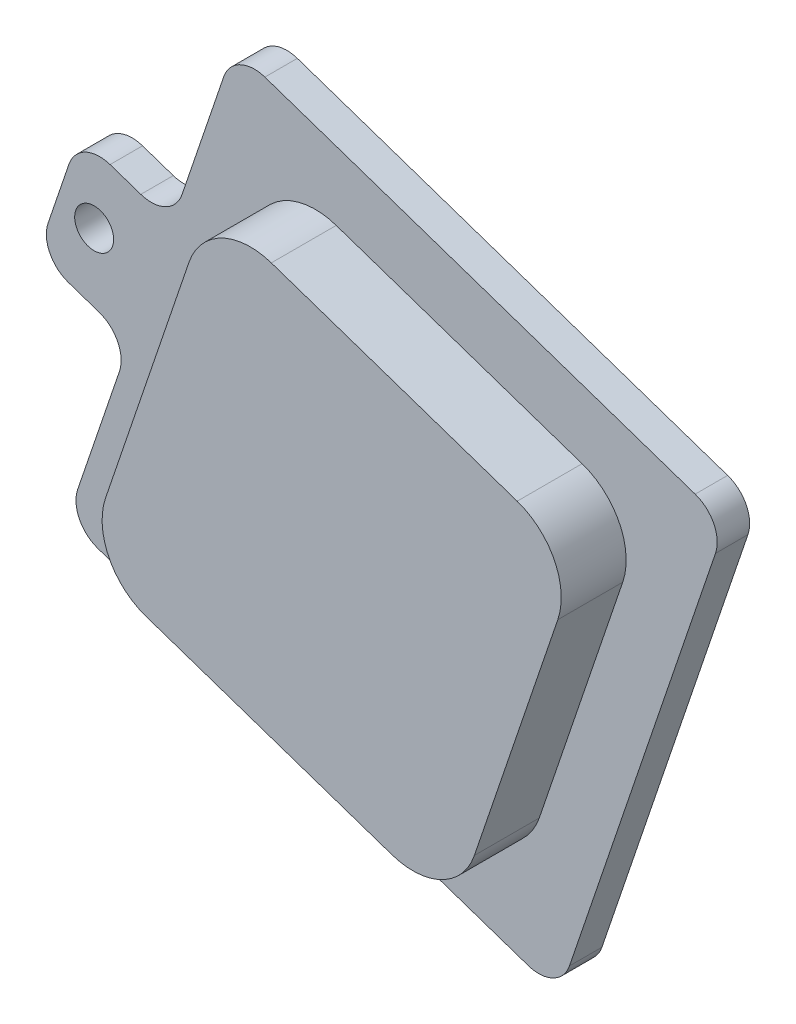
ISO-10303-21;
HEADER;
FILE_DESCRIPTION(('STEP AP214'),'2;1');
FILE_NAME('part.step','',(''),(''),'','','');
FILE_SCHEMA(('AUTOMOTIVE_DESIGN { 1 0 10303 214 1 1 1 1 }'));
ENDSEC;
DATA;
#1=APPLICATION_CONTEXT('core data for automotive mechanical design processes');
#2=APPLICATION_PROTOCOL_DEFINITION('international standard','automotive_design',2000,#1);
#3=PRODUCT_CONTEXT('',#1,'mechanical');
#4=PRODUCT('Part','Part','',(#3));
#5=PRODUCT_RELATED_PRODUCT_CATEGORY('part','',(#4));
#6=PRODUCT_DEFINITION_FORMATION('','',#4);
#7=PRODUCT_DEFINITION_CONTEXT('part definition',#1,'design');
#8=PRODUCT_DEFINITION('design','',#6,#7);
#9=PRODUCT_DEFINITION_SHAPE('','',#8);
#10=(LENGTH_UNIT() NAMED_UNIT(*) SI_UNIT(.MILLI.,.METRE.));
#11=(NAMED_UNIT(*) PLANE_ANGLE_UNIT() SI_UNIT($,.RADIAN.));
#12=(NAMED_UNIT(*) SI_UNIT($,.STERADIAN.) SOLID_ANGLE_UNIT());
#13=UNCERTAINTY_MEASURE_WITH_UNIT(LENGTH_MEASURE(1.E-05),#10,'distance_accuracy_value','');
#14=(GEOMETRIC_REPRESENTATION_CONTEXT(3) GLOBAL_UNCERTAINTY_ASSIGNED_CONTEXT((#13)) GLOBAL_UNIT_ASSIGNED_CONTEXT((#10,
#11,#12)) REPRESENTATION_CONTEXT('',''));
#15=CARTESIAN_POINT('',(0.,0.,0.));
#16=DIRECTION('',(0.,0.,1.));
#17=DIRECTION('',(1.,0.,0.));
#18=AXIS2_PLACEMENT_3D('',#15,#16,#17);
#19=CARTESIAN_POINT('',(0.,0.,3.175));
#20=DIRECTION('',(0.,0.,1.));
#21=DIRECTION('',(1.,0.,0.));
#22=AXIS2_PLACEMENT_3D('',#19,#20,#21);
#23=PLANE('',#22);
#24=CARTESIAN_POINT('',(-6.82627897238503,9.42656393700877,3.175));
#25=DIRECTION('',(0.,0.,1.));
#26=DIRECTION('',(1.,0.,0.));
#27=AXIS2_PLACEMENT_3D('',#24,#25,#26);
#28=CIRCLE('',#27,1.90499999999999);
#29=CARTESIAN_POINT('',(-4.92127897238505,9.42656393700877,3.175));
#30=VERTEX_POINT('',#29);
#31=EDGE_CURVE('E519',#30,#30,#28,.T.);
#32=ORIENTED_EDGE('',*,*,#31,.F.);
#33=EDGE_LOOP('',(#32));
#34=FACE_BOUND('',#33,.T.);
#35=DIRECTION('',(0.946970684541196,-0.321319969220056,0.));
#36=VECTOR('',#35,1.);
#37=CARTESIAN_POINT('',(-18.4754992217396,-13.4430700037001,3.175));
#38=LINE('',#37,#36);
#39=CARTESIAN_POINT('',(-6.44897152806643,-17.5238336127949,3.175));
#40=VERTEX_POINT('',#39);
#41=CARTESIAN_POINT('',(35.6438753997898,-31.8065062446263,3.175));
#42=VERTEX_POINT('',#41);
#43=EDGE_CURVE('E234',#40,#42,#38,.T.);
#44=ORIENTED_EDGE('',*,*,#43,.T.);
#45=CARTESIAN_POINT('',(36.6640663020634,-28.799874321208,3.175));
#46=DIRECTION('',(0.,0.,1.));
#47=DIRECTION('',(1.,0.,0.));
#48=AXIS2_PLACEMENT_3D('',#45,#46,#47);
#49=CIRCLE('',#48,3.175);
#50=CARTESIAN_POINT('',(39.6706982254818,-29.8200652234817,3.175));
#51=VERTEX_POINT('',#50);
#52=EDGE_CURVE('E274',#42,#51,#49,.T.);
#53=ORIENTED_EDGE('',*,*,#52,.T.);
#54=DIRECTION('',(0.321319969220055,0.946970684541197,0.));
#55=VECTOR('',#54,1.);
#56=CARTESIAN_POINT('',(38.6505073232081,-32.8266971469,3.175));
#57=LINE('',#56,#55);
#58=CARTESIAN_POINT('',(53.9533708573132,12.2727817043745,3.175));
#59=VERTEX_POINT('',#58);
#60=EDGE_CURVE('E243',#51,#59,#57,.T.);
#61=ORIENTED_EDGE('',*,*,#60,.T.);
#62=CARTESIAN_POINT('',(50.9467389338949,13.2929726066482,3.175));
#63=DIRECTION('',(0.,0.,1.));
#64=DIRECTION('',(1.,0.,0.));
#65=AXIS2_PLACEMENT_3D('',#62,#63,#64);
#66=CIRCLE('',#65,3.175);
#67=CARTESIAN_POINT('',(51.9669298361686,16.2996045300665,3.175));
#68=VERTEX_POINT('',#67);
#69=EDGE_CURVE('E268',#59,#68,#66,.T.);
#70=ORIENTED_EDGE('',*,*,#69,.T.);
#71=DIRECTION('',(-0.946970684541197,0.321319969220055,0.));
#72=VECTOR('',#71,1.);
#73=CARTESIAN_POINT('',(54.9735617595869,15.2794136277928,3.175));
#74=LINE('',#73,#72);
#75=CARTESIAN_POINT('',(9.87408290831238,30.5822771618979,3.175));
#76=VERTEX_POINT('',#75);
#77=EDGE_CURVE('E246',#68,#76,#74,.T.);
#78=ORIENTED_EDGE('',*,*,#77,.T.);
#79=CARTESIAN_POINT('',(8.85389200603872,27.5756452384796,3.175));
#80=DIRECTION('',(0.,0.,1.));
#81=DIRECTION('',(1.,0.,0.));
#82=AXIS2_PLACEMENT_3D('',#79,#80,#81);
#83=CIRCLE('',#82,3.175);
#84=CARTESIAN_POINT('',(5.84726008262042,28.5958361407533,3.175));
#85=VERTEX_POINT('',#84);
#86=EDGE_CURVE('E270',#76,#85,#83,.T.);
#87=ORIENTED_EDGE('',*,*,#86,.T.);
#88=DIRECTION('',(-0.321319969220055,-0.946970684541197,0.));
#89=VECTOR('',#88,1.);
#90=CARTESIAN_POINT('',(6.86745098489409,31.6024680641716,3.175));
#91=LINE('',#90,#89);
#92=CARTESIAN_POINT('',(1.76649647352571,16.5693084470801,3.175));
#93=VERTEX_POINT('',#92);
#94=EDGE_CURVE('E221',#85,#93,#91,.T.);
#95=ORIENTED_EDGE('',*,*,#94,.T.);
#96=CARTESIAN_POINT('',(-1.24013544989258,17.5894993493538,3.175));
#97=DIRECTION('',(0.,0.,1.));
#98=DIRECTION('',(1.,0.,0.));
#99=AXIS2_PLACEMENT_3D('',#96,#97,#98);
#100=CIRCLE('',#99,3.175);
#101=CARTESIAN_POINT('',(-2.26032635216626,14.5828674259355,3.175));
#102=VERTEX_POINT('',#101);
#103=EDGE_CURVE('E203',#93,#102,#100,.F.);
#104=ORIENTED_EDGE('',*,*,#103,.T.);
#105=DIRECTION('',(-0.946970684541197,0.321319969220055,0.));
#106=VECTOR('',#105,1.);
#107=CARTESIAN_POINT('',(0.746305571252041,13.5626765236618,3.175));
#108=LINE('',#107,#106);
#109=CARTESIAN_POINT('',(-5.26695827558457,15.6030583282092,3.175));
#110=VERTEX_POINT('',#109);
#111=EDGE_CURVE('E213',#102,#110,#108,.T.);
#112=ORIENTED_EDGE('',*,*,#111,.T.);
#113=CARTESIAN_POINT('',(-6.28714917785825,12.5964264047909,3.175));
#114=DIRECTION('',(0.,0.,1.));
#115=DIRECTION('',(1.,0.,0.));
#116=AXIS2_PLACEMENT_3D('',#113,#114,#115);
#117=CIRCLE('',#116,3.175);
#118=CARTESIAN_POINT('',(-9.29378110127655,13.6166173070645,3.175));
#119=VERTEX_POINT('',#118);
#120=EDGE_CURVE('E264',#110,#119,#117,.T.);
#121=ORIENTED_EDGE('',*,*,#120,.T.);
#122=DIRECTION('',(-0.321319969220055,-0.946970684541197,0.));
#123=VECTOR('',#122,1.);
#124=CARTESIAN_POINT('',(-2.15244478536083,34.6630407709926,3.175));
#125=LINE('',#124,#123);
#126=CARTESIAN_POINT('',(-11.3341629058239,7.60335346022794,3.175));
#127=VERTEX_POINT('',#126);
#128=EDGE_CURVE('E249',#119,#127,#125,.T.);
#129=ORIENTED_EDGE('',*,*,#128,.T.);
#130=CARTESIAN_POINT('',(-8.3275309824056,6.58316255795425,3.175));
#131=DIRECTION('',(0.,0.,1.));
#132=DIRECTION('',(1.,0.,0.));
#133=AXIS2_PLACEMENT_3D('',#130,#131,#132);
#134=CIRCLE('',#133,3.175);
#135=CARTESIAN_POINT('',(-9.34772188467928,3.57653063453595,3.175));
#136=VERTEX_POINT('',#135);
#137=EDGE_CURVE('E266',#127,#136,#134,.T.);
#138=ORIENTED_EDGE('',*,*,#137,.T.);
#139=DIRECTION('',(0.946970684541197,-0.321319969220055,0.));
#140=VECTOR('',#139,1.);
#141=CARTESIAN_POINT('',(-12.3543538080976,4.59672153680963,3.175));
#142=LINE('',#141,#140);
#143=CARTESIAN_POINT('',(-6.34108996126098,2.55633973226228,3.175));
#144=VERTEX_POINT('',#143);
#145=EDGE_CURVE('E387',#136,#144,#142,.T.);
#146=ORIENTED_EDGE('',*,*,#145,.T.);
#147=CARTESIAN_POINT('',(-7.36128086353465,-0.450292191156025,3.175));
#148=DIRECTION('',(0.,0.,1.));
#149=DIRECTION('',(1.,0.,0.));
#150=AXIS2_PLACEMENT_3D('',#147,#148,#149);
#151=CIRCLE('',#150,3.175);
#152=CARTESIAN_POINT('',(-4.35464894011635,-1.4704830934297,3.175));
#153=VERTEX_POINT('',#152);
#154=EDGE_CURVE('E313',#144,#153,#151,.F.);
#155=ORIENTED_EDGE('',*,*,#154,.T.);
#156=DIRECTION('',(-0.321319969220056,-0.946970684541197,0.));
#157=VECTOR('',#156,1.);
#158=CARTESIAN_POINT('',(-3.33445803784267,1.5361488299886,3.175));
#159=LINE('',#158,#157);
#160=CARTESIAN_POINT('',(-8.43541254921105,-13.4970107871029,3.175));
#161=VERTEX_POINT('',#160);
#162=EDGE_CURVE('E226',#153,#161,#159,.T.);
#163=ORIENTED_EDGE('',*,*,#162,.T.);
#164=CARTESIAN_POINT('',(-5.42878062579275,-14.5172016893766,3.175));
#165=DIRECTION('',(0.,0.,1.));
#166=DIRECTION('',(1.,0.,0.));
#167=AXIS2_PLACEMENT_3D('',#164,#165,#166);
#168=CIRCLE('',#167,3.175);
#169=EDGE_CURVE('E272',#161,#40,#168,.T.);
#170=ORIENTED_EDGE('',*,*,#169,.T.);
#171=EDGE_LOOP('',(#44,#53,#61,#70,#78,#87,#95,#104,#112,#121,#129,#138,#146,#155,#163,#170));
#172=FACE_BOUND('',#171,.T.);
#173=DIRECTION('',(-0.321319969220055,-0.946970684541197,0.));
#174=VECTOR('',#173,1.);
#175=CARTESIAN_POINT('',(-1.40195780010076,-12.530760668232,3.175));
#176=LINE('',#175,#174);
#177=CARTESIAN_POINT('',(8.79995122263599,17.535558565951,3.175));
#178=VERTEX_POINT('',#177);
#179=CARTESIAN_POINT('',(0.63842400444659,-6.51749682139537,3.175));
#180=VERTEX_POINT('',#179);
#181=EDGE_CURVE('E355',#178,#180,#176,.T.);
#182=ORIENTED_EDGE('',*,*,#181,.F.);
#183=CARTESIAN_POINT('',(14.8132150694726,15.4951767614037,3.175));
#184=DIRECTION('',(0.,0.,1.));
#185=DIRECTION('',(1.,0.,0.));
#186=AXIS2_PLACEMENT_3D('',#183,#184,#185);
#187=CIRCLE('',#186,6.35);
#188=CARTESIAN_POINT('',(16.8535968740199,21.5084406082403,3.175));
#189=VERTEX_POINT('',#188);
#190=EDGE_CURVE('E342',#178,#189,#187,.F.);
#191=ORIENTED_EDGE('',*,*,#190,.T.);
#192=DIRECTION('',(-0.946970684541197,0.321319969220055,0.));
#193=VECTOR('',#192,1.);
#194=CARTESIAN_POINT('',(10.8403330271833,23.5488224127876,3.175));
#195=LINE('',#194,#193);
#196=CARTESIAN_POINT('',(40.9066522613663,13.3469133900509,3.175));
#197=VERTEX_POINT('',#196);
#198=EDGE_CURVE('E379',#197,#189,#195,.T.);
#199=ORIENTED_EDGE('',*,*,#198,.F.);
#200=CARTESIAN_POINT('',(38.8662704568189,7.33364954321432,3.175));
#201=DIRECTION('',(0.,0.,1.));
#202=DIRECTION('',(1.,0.,0.));
#203=AXIS2_PLACEMENT_3D('',#200,#201,#202);
#204=CIRCLE('',#203,6.35);
#205=CARTESIAN_POINT('',(44.8795343036555,5.29326773866698,3.175));
#206=VERTEX_POINT('',#205);
#207=EDGE_CURVE('E11',#197,#206,#204,.F.);
#208=ORIENTED_EDGE('',*,*,#207,.T.);
#209=DIRECTION('',(0.321319969220055,0.946970684541197,0.));
#210=VECTOR('',#209,1.);
#211=CARTESIAN_POINT('',(46.9199161082029,11.3065315855036,3.175));
#212=LINE('',#211,#210);
#213=CARTESIAN_POINT('',(36.7180070854661,-18.7597876486794,3.175));
#214=VERTEX_POINT('',#213);
#215=EDGE_CURVE('E349',#214,#206,#212,.T.);
#216=ORIENTED_EDGE('',*,*,#215,.F.);
#217=CARTESIAN_POINT('',(30.7047432386295,-16.7194058441321,3.175));
#218=DIRECTION('',(0.,0.,1.));
#219=DIRECTION('',(1.,0.,0.));
#220=AXIS2_PLACEMENT_3D('',#217,#218,#219);
#221=CIRCLE('',#220,6.35);
#222=CARTESIAN_POINT('',(28.6643614340822,-22.7326696909687,3.175));
#223=VERTEX_POINT('',#222);
#224=EDGE_CURVE('E41',#214,#223,#221,.F.);
#225=ORIENTED_EDGE('',*,*,#224,.T.);
#226=DIRECTION('',(0.946970684541197,-0.321319969220055,0.));
#227=VECTOR('',#226,1.);
#228=CARTESIAN_POINT('',(34.6776252809188,-24.7730514955161,3.175));
#229=LINE('',#228,#227);
#230=CARTESIAN_POINT('',(4.61130604673584,-14.5711424727793,3.175));
#231=VERTEX_POINT('',#230);
#232=EDGE_CURVE('E348',#231,#223,#229,.T.);
#233=ORIENTED_EDGE('',*,*,#232,.F.);
#234=CARTESIAN_POINT('',(6.65168785128319,-8.55787862594272,3.175));
#235=DIRECTION('',(0.,0.,1.));
#236=DIRECTION('',(1.,0.,0.));
#237=AXIS2_PLACEMENT_3D('',#234,#235,#236);
#238=CIRCLE('',#237,6.35);
#239=EDGE_CURVE('E344',#231,#180,#238,.F.);
#240=ORIENTED_EDGE('',*,*,#239,.T.);
#241=EDGE_LOOP('',(#182,#191,#199,#208,#216,#225,#233,#240));
#242=FACE_BOUND('',#241,.T.);
#243=ADVANCED_FACE('F33',(#34,#172,#242),#23,.T.);
#244=CARTESIAN_POINT('',(38.6505073232081,-32.8266971469,0.));
#245=DIRECTION('',(0.946970684541197,-0.321319969220055,0.));
#246=DIRECTION('',(0.321319969220055,0.946970684541197,0.));
#247=AXIS2_PLACEMENT_3D('',#244,#245,#246);
#248=PLANE('',#247);
#249=ORIENTED_EDGE('',*,*,#60,.F.);
#250=DIRECTION('',(0.,0.,1.));
#251=VECTOR('',#250,1.);
#252=CARTESIAN_POINT('',(39.6706982254818,-29.8200652234817,0.));
#253=LINE('',#252,#251);
#254=CARTESIAN_POINT('',(39.6706982254818,-29.8200652234817,0.));
#255=VERTEX_POINT('',#254);
#256=EDGE_CURVE('E279',#51,#255,#253,.F.);
#257=ORIENTED_EDGE('',*,*,#256,.T.);
#258=DIRECTION('',(0.321319969220055,0.946970684541197,0.));
#259=VECTOR('',#258,1.);
#260=CARTESIAN_POINT('',(38.6505073232081,-32.8266971469,0.));
#261=LINE('',#260,#259);
#262=CARTESIAN_POINT('',(53.9533708573132,12.2727817043745,0.));
#263=VERTEX_POINT('',#262);
#264=EDGE_CURVE('E230',#255,#263,#261,.T.);
#265=ORIENTED_EDGE('',*,*,#264,.T.);
#266=DIRECTION('',(0.,0.,1.));
#267=VECTOR('',#266,1.);
#268=CARTESIAN_POINT('',(53.9533708573132,12.2727817043745,0.));
#269=LINE('',#268,#267);
#270=EDGE_CURVE('E276',#263,#59,#269,.T.);
#271=ORIENTED_EDGE('',*,*,#270,.T.);
#272=EDGE_LOOP('',(#249,#257,#265,#271));
#273=FACE_BOUND('',#272,.T.);
#274=ADVANCED_FACE('F433',(#273),#248,.T.);
#275=CARTESIAN_POINT('',(-18.4754992217396,-13.4430700037001,0.));
#276=DIRECTION('',(-0.321319969220056,-0.946970684541196,0.));
#277=DIRECTION('',(0.946970684541197,-0.321319969220056,0.));
#278=AXIS2_PLACEMENT_3D('',#275,#276,#277);
#279=PLANE('',#278);
#280=DIRECTION('',(0.946970684541196,-0.321319969220056,0.));
#281=VECTOR('',#280,1.);
#282=CARTESIAN_POINT('',(-18.4754992217396,-13.4430700037001,0.));
#283=LINE('',#282,#281);
#284=CARTESIAN_POINT('',(-6.44897152806643,-17.5238336127949,0.));
#285=VERTEX_POINT('',#284);
#286=CARTESIAN_POINT('',(35.6438753997898,-31.8065062446263,0.));
#287=VERTEX_POINT('',#286);
#288=EDGE_CURVE('E240',#285,#287,#283,.T.);
#289=ORIENTED_EDGE('',*,*,#288,.T.);
#290=DIRECTION('',(0.,0.,1.));
#291=VECTOR('',#290,1.);
#292=CARTESIAN_POINT('',(35.6438753997898,-31.8065062446263,0.));
#293=LINE('',#292,#291);
#294=EDGE_CURVE('E261',#287,#42,#293,.T.);
#295=ORIENTED_EDGE('',*,*,#294,.T.);
#296=ORIENTED_EDGE('',*,*,#43,.F.);
#297=DIRECTION('',(0.,0.,-1.));
#298=VECTOR('',#297,1.);
#299=CARTESIAN_POINT('',(-6.44897152806643,-17.5238336127949,0.));
#300=LINE('',#299,#298);
#301=EDGE_CURVE('E258',#40,#285,#300,.T.);
#302=ORIENTED_EDGE('',*,*,#301,.T.);
#303=EDGE_LOOP('',(#289,#295,#296,#302));
#304=FACE_BOUND('',#303,.T.);
#305=ADVANCED_FACE('F427',(#304),#279,.T.);
#306=CARTESIAN_POINT('',(-2.15244478536083,34.6630407709926,0.));
#307=DIRECTION('',(-0.946970684541197,0.321319969220055,0.));
#308=DIRECTION('',(-0.321319969220055,-0.946970684541197,0.));
#309=AXIS2_PLACEMENT_3D('',#306,#307,#308);
#310=PLANE('',#309);
#311=DIRECTION('',(-0.321319969220055,-0.946970684541197,0.));
#312=VECTOR('',#311,1.);
#313=CARTESIAN_POINT('',(-2.15244478536083,34.6630407709926,0.));
#314=LINE('',#313,#312);
#315=CARTESIAN_POINT('',(-9.29378110127655,13.6166173070645,0.));
#316=VERTEX_POINT('',#315);
#317=CARTESIAN_POINT('',(-11.3341629058239,7.60335346022794,0.));
#318=VERTEX_POINT('',#317);
#319=EDGE_CURVE('E237',#316,#318,#314,.T.);
#320=ORIENTED_EDGE('',*,*,#319,.T.);
#321=DIRECTION('',(0.,0.,-1.));
#322=VECTOR('',#321,1.);
#323=CARTESIAN_POINT('',(-11.3341629058239,7.60335346022793,3.175));
#324=LINE('',#323,#322);
#325=EDGE_CURVE('E204',#318,#127,#324,.F.);
#326=ORIENTED_EDGE('',*,*,#325,.T.);
#327=ORIENTED_EDGE('',*,*,#128,.F.);
#328=DIRECTION('',(0.,0.,-1.));
#329=VECTOR('',#328,1.);
#330=CARTESIAN_POINT('',(-9.29378110127655,13.6166173070645,0.));
#331=LINE('',#330,#329);
#332=EDGE_CURVE('E306',#119,#316,#331,.T.);
#333=ORIENTED_EDGE('',*,*,#332,.T.);
#334=EDGE_LOOP('',(#320,#326,#327,#333));
#335=FACE_BOUND('',#334,.T.);
#336=ADVANCED_FACE('F400',(#335),#310,.T.);
#337=CARTESIAN_POINT('',(54.9735617595869,15.2794136277928,0.));
#338=DIRECTION('',(0.321319969220055,0.946970684541197,0.));
#339=DIRECTION('',(-0.946970684541197,0.321319969220055,0.));
#340=AXIS2_PLACEMENT_3D('',#337,#338,#339);
#341=PLANE('',#340);
#342=DIRECTION('',(-0.946970684541197,0.321319969220055,0.));
#343=VECTOR('',#342,1.);
#344=CARTESIAN_POINT('',(54.9735617595869,15.2794136277928,0.));
#345=LINE('',#344,#343);
#346=CARTESIAN_POINT('',(51.9669298361686,16.2996045300665,0.));
#347=VERTEX_POINT('',#346);
#348=CARTESIAN_POINT('',(9.87408290831238,30.5822771618979,0.));
#349=VERTEX_POINT('',#348);
#350=EDGE_CURVE('E233',#347,#349,#345,.T.);
#351=ORIENTED_EDGE('',*,*,#350,.T.);
#352=DIRECTION('',(0.,0.,-1.));
#353=VECTOR('',#352,1.);
#354=CARTESIAN_POINT('',(9.87408290831239,30.5822771618979,3.175));
#355=LINE('',#354,#353);
#356=EDGE_CURVE('E299',#349,#76,#355,.F.);
#357=ORIENTED_EDGE('',*,*,#356,.T.);
#358=ORIENTED_EDGE('',*,*,#77,.F.);
#359=DIRECTION('',(0.,0.,1.));
#360=VECTOR('',#359,1.);
#361=CARTESIAN_POINT('',(51.9669298361686,16.2996045300665,0.));
#362=LINE('',#361,#360);
#363=EDGE_CURVE('E297',#68,#347,#362,.F.);
#364=ORIENTED_EDGE('',*,*,#363,.T.);
#365=EDGE_LOOP('',(#351,#357,#358,#364));
#366=FACE_BOUND('',#365,.T.);
#367=ADVANCED_FACE('F445',(#366),#341,.T.);
#368=CARTESIAN_POINT('',(0.,0.,0.));
#369=DIRECTION('',(0.,0.,1.));
#370=DIRECTION('',(1.,0.,0.));
#371=AXIS2_PLACEMENT_3D('',#368,#369,#370);
#372=PLANE('',#371);
#373=CARTESIAN_POINT('',(-6.82627897238503,9.42656393700877,0.));
#374=DIRECTION('',(0.,0.,1.));
#375=DIRECTION('',(1.,0.,0.));
#376=AXIS2_PLACEMENT_3D('',#373,#374,#375);
#377=CIRCLE('',#376,1.90499999999999);
#378=CARTESIAN_POINT('',(-4.92127897238505,9.42656393700877,0.));
#379=VERTEX_POINT('',#378);
#380=EDGE_CURVE('E382',#379,#379,#377,.T.);
#381=ORIENTED_EDGE('',*,*,#380,.T.);
#382=EDGE_LOOP('',(#381));
#383=FACE_BOUND('',#382,.T.);
#384=ORIENTED_EDGE('',*,*,#264,.F.);
#385=CARTESIAN_POINT('',(36.6640663020634,-28.799874321208,0.));
#386=DIRECTION('',(0.,0.,1.));
#387=DIRECTION('',(1.,0.,0.));
#388=AXIS2_PLACEMENT_3D('',#385,#386,#387);
#389=CIRCLE('',#388,3.175);
#390=EDGE_CURVE('E290',#255,#287,#389,.F.);
#391=ORIENTED_EDGE('',*,*,#390,.T.);
#392=ORIENTED_EDGE('',*,*,#288,.F.);
#393=CARTESIAN_POINT('',(-5.42878062579275,-14.5172016893766,0.));
#394=DIRECTION('',(0.,0.,1.));
#395=DIRECTION('',(1.,0.,0.));
#396=AXIS2_PLACEMENT_3D('',#393,#394,#395);
#397=CIRCLE('',#396,3.175);
#398=CARTESIAN_POINT('',(-8.43541254921105,-13.4970107871029,0.));
#399=VERTEX_POINT('',#398);
#400=EDGE_CURVE('E288',#285,#399,#397,.F.);
#401=ORIENTED_EDGE('',*,*,#400,.T.);
#402=DIRECTION('',(-0.321319969220056,-0.946970684541197,0.));
#403=VECTOR('',#402,1.);
#404=CARTESIAN_POINT('',(-3.33445803784267,1.5361488299886,0.));
#405=LINE('',#404,#403);
#406=CARTESIAN_POINT('',(-4.35464894011635,-1.4704830934297,0.));
#407=VERTEX_POINT('',#406);
#408=EDGE_CURVE('E373',#407,#399,#405,.T.);
#409=ORIENTED_EDGE('',*,*,#408,.F.);
#410=CARTESIAN_POINT('',(-7.36128086353465,-0.450292191156025,0.));
#411=DIRECTION('',(0.,0.,1.));
#412=DIRECTION('',(1.,0.,0.));
#413=AXIS2_PLACEMENT_3D('',#410,#411,#412);
#414=CIRCLE('',#413,3.175);
#415=CARTESIAN_POINT('',(-6.34108996126098,2.55633973226228,0.));
#416=VERTEX_POINT('',#415);
#417=EDGE_CURVE('E311',#407,#416,#414,.T.);
#418=ORIENTED_EDGE('',*,*,#417,.T.);
#419=DIRECTION('',(0.946970684541197,-0.321319969220055,0.));
#420=VECTOR('',#419,1.);
#421=CARTESIAN_POINT('',(-12.3543538080976,4.59672153680963,0.));
#422=LINE('',#421,#420);
#423=CARTESIAN_POINT('',(-9.34772188467928,3.57653063453595,0.));
#424=VERTEX_POINT('',#423);
#425=EDGE_CURVE('E370',#424,#416,#422,.T.);
#426=ORIENTED_EDGE('',*,*,#425,.F.);
#427=CARTESIAN_POINT('',(-8.3275309824056,6.58316255795425,0.));
#428=DIRECTION('',(0.,0.,1.));
#429=DIRECTION('',(1.,0.,0.));
#430=AXIS2_PLACEMENT_3D('',#427,#428,#429);
#431=CIRCLE('',#430,3.175);
#432=EDGE_CURVE('E282',#424,#318,#431,.F.);
#433=ORIENTED_EDGE('',*,*,#432,.T.);
#434=ORIENTED_EDGE('',*,*,#319,.F.);
#435=CARTESIAN_POINT('',(-6.28714917785825,12.5964264047909,0.));
#436=DIRECTION('',(0.,0.,1.));
#437=DIRECTION('',(1.,0.,0.));
#438=AXIS2_PLACEMENT_3D('',#435,#436,#437);
#439=CIRCLE('',#438,3.175);
#440=CARTESIAN_POINT('',(-5.26695827558457,15.6030583282092,0.));
#441=VERTEX_POINT('',#440);
#442=EDGE_CURVE('E220',#316,#441,#439,.F.);
#443=ORIENTED_EDGE('',*,*,#442,.T.);
#444=DIRECTION('',(-0.946970684541197,0.321319969220055,0.));
#445=VECTOR('',#444,1.);
#446=CARTESIAN_POINT('',(0.746305571252041,13.5626765236618,0.));
#447=LINE('',#446,#445);
#448=CARTESIAN_POINT('',(-2.26032635216626,14.5828674259355,0.));
#449=VERTEX_POINT('',#448);
#450=EDGE_CURVE('E210',#449,#441,#447,.T.);
#451=ORIENTED_EDGE('',*,*,#450,.F.);
#452=CARTESIAN_POINT('',(-1.24013544989258,17.5894993493538,0.));
#453=DIRECTION('',(0.,0.,1.));
#454=DIRECTION('',(1.,0.,0.));
#455=AXIS2_PLACEMENT_3D('',#452,#453,#454);
#456=CIRCLE('',#455,3.175);
#457=CARTESIAN_POINT('',(1.76649647352571,16.5693084470801,0.));
#458=VERTEX_POINT('',#457);
#459=EDGE_CURVE('E193',#449,#458,#456,.T.);
#460=ORIENTED_EDGE('',*,*,#459,.T.);
#461=DIRECTION('',(-0.321319969220055,-0.946970684541197,0.));
#462=VECTOR('',#461,1.);
#463=CARTESIAN_POINT('',(6.86745098489409,31.6024680641716,0.));
#464=LINE('',#463,#462);
#465=CARTESIAN_POINT('',(5.84726008262042,28.5958361407533,0.));
#466=VERTEX_POINT('',#465);
#467=EDGE_CURVE('E222',#466,#458,#464,.T.);
#468=ORIENTED_EDGE('',*,*,#467,.F.);
#469=CARTESIAN_POINT('',(8.85389200603872,27.5756452384796,0.));
#470=DIRECTION('',(0.,0.,1.));
#471=DIRECTION('',(1.,0.,0.));
#472=AXIS2_PLACEMENT_3D('',#469,#470,#471);
#473=CIRCLE('',#472,3.175);
#474=EDGE_CURVE('E286',#466,#349,#473,.F.);
#475=ORIENTED_EDGE('',*,*,#474,.T.);
#476=ORIENTED_EDGE('',*,*,#350,.F.);
#477=CARTESIAN_POINT('',(50.9467389338949,13.2929726066482,0.));
#478=DIRECTION('',(0.,0.,1.));
#479=DIRECTION('',(1.,0.,0.));
#480=AXIS2_PLACEMENT_3D('',#477,#478,#479);
#481=CIRCLE('',#480,3.175);
#482=EDGE_CURVE('E284',#347,#263,#481,.F.);
#483=ORIENTED_EDGE('',*,*,#482,.T.);
#484=EDGE_LOOP('',(#384,#391,#392,#401,#409,#418,#426,#433,#434,#443,#451,#460,#468,#475,#476,#483));
#485=FACE_BOUND('',#484,.T.);
#486=ADVANCED_FACE('F218',(#383,#485),#372,.F.);
#487=CARTESIAN_POINT('',(0.746305571252041,13.5626765236618,3.175));
#488=DIRECTION('',(-0.321319969220055,-0.946970684541197,0.));
#489=DIRECTION('',(0.946970684541197,-0.321319969220055,0.));
#490=AXIS2_PLACEMENT_3D('',#487,#488,#489);
#491=PLANE('',#490);
#492=ORIENTED_EDGE('',*,*,#111,.F.);
#493=DIRECTION('',(0.,0.,-1.));
#494=VECTOR('',#493,1.);
#495=CARTESIAN_POINT('',(-2.26032635216626,14.5828674259355,0.));
#496=LINE('',#495,#494);
#497=EDGE_CURVE('E197',#102,#449,#496,.T.);
#498=ORIENTED_EDGE('',*,*,#497,.T.);
#499=ORIENTED_EDGE('',*,*,#450,.T.);
#500=DIRECTION('',(0.,0.,-1.));
#501=VECTOR('',#500,1.);
#502=CARTESIAN_POINT('',(-5.26695827558458,15.6030583282092,3.175));
#503=LINE('',#502,#501);
#504=EDGE_CURVE('E215',#441,#110,#503,.F.);
#505=ORIENTED_EDGE('',*,*,#504,.T.);
#506=EDGE_LOOP('',(#492,#498,#499,#505));
#507=FACE_BOUND('',#506,.T.);
#508=ADVANCED_FACE('F209',(#507),#491,.F.);
#509=CARTESIAN_POINT('',(6.86745098489409,31.6024680641716,3.175));
#510=DIRECTION('',(0.946970684541197,-0.321319969220055,0.));
#511=DIRECTION('',(0.321319969220055,0.946970684541197,0.));
#512=AXIS2_PLACEMENT_3D('',#509,#510,#511);
#513=PLANE('',#512);
#514=ORIENTED_EDGE('',*,*,#467,.T.);
#515=DIRECTION('',(0.,0.,-1.));
#516=VECTOR('',#515,1.);
#517=CARTESIAN_POINT('',(1.76649647352572,16.5693084470801,3.175));
#518=LINE('',#517,#516);
#519=EDGE_CURVE('E198',#458,#93,#518,.F.);
#520=ORIENTED_EDGE('',*,*,#519,.T.);
#521=ORIENTED_EDGE('',*,*,#94,.F.);
#522=DIRECTION('',(0.,0.,-1.));
#523=VECTOR('',#522,1.);
#524=CARTESIAN_POINT('',(5.84726008262042,28.5958361407533,0.));
#525=LINE('',#524,#523);
#526=EDGE_CURVE('E214',#85,#466,#525,.T.);
#527=ORIENTED_EDGE('',*,*,#526,.T.);
#528=EDGE_LOOP('',(#514,#520,#521,#527));
#529=FACE_BOUND('',#528,.T.);
#530=ADVANCED_FACE('F452',(#529),#513,.F.);
#531=CARTESIAN_POINT('',(-3.33445803784267,1.5361488299886,3.175));
#532=DIRECTION('',(0.946970684541196,-0.321319969220056,0.));
#533=DIRECTION('',(0.321319969220056,0.946970684541197,0.));
#534=AXIS2_PLACEMENT_3D('',#531,#532,#533);
#535=PLANE('',#534);
#536=ORIENTED_EDGE('',*,*,#408,.T.);
#537=DIRECTION('',(0.,0.,-1.));
#538=VECTOR('',#537,1.);
#539=CARTESIAN_POINT('',(-8.43541254921105,-13.4970107871029,3.175));
#540=LINE('',#539,#538);
#541=EDGE_CURVE('E295',#399,#161,#540,.F.);
#542=ORIENTED_EDGE('',*,*,#541,.T.);
#543=ORIENTED_EDGE('',*,*,#162,.F.);
#544=DIRECTION('',(0.,0.,-1.));
#545=VECTOR('',#544,1.);
#546=CARTESIAN_POINT('',(-4.35464894011635,-1.4704830934297,0.));
#547=LINE('',#546,#545);
#548=EDGE_CURVE('E292',#153,#407,#547,.T.);
#549=ORIENTED_EDGE('',*,*,#548,.T.);
#550=EDGE_LOOP('',(#536,#542,#543,#549));
#551=FACE_BOUND('',#550,.T.);
#552=ADVANCED_FACE('F418',(#551),#535,.F.);
#553=CARTESIAN_POINT('',(-12.3543538080976,4.59672153680963,3.175));
#554=DIRECTION('',(0.321319969220055,0.946970684541197,0.));
#555=DIRECTION('',(-0.946970684541197,0.321319969220055,0.));
#556=AXIS2_PLACEMENT_3D('',#553,#554,#555);
#557=PLANE('',#556);
#558=ORIENTED_EDGE('',*,*,#145,.F.);
#559=DIRECTION('',(0.,0.,-1.));
#560=VECTOR('',#559,1.);
#561=CARTESIAN_POINT('',(-9.34772188467928,3.57653063453595,0.));
#562=LINE('',#561,#560);
#563=EDGE_CURVE('E303',#136,#424,#562,.T.);
#564=ORIENTED_EDGE('',*,*,#563,.T.);
#565=ORIENTED_EDGE('',*,*,#425,.T.);
#566=DIRECTION('',(0.,0.,-1.));
#567=VECTOR('',#566,1.);
#568=CARTESIAN_POINT('',(-6.34108996126098,2.55633973226228,3.175));
#569=LINE('',#568,#567);
#570=EDGE_CURVE('E301',#416,#144,#569,.F.);
#571=ORIENTED_EDGE('',*,*,#570,.T.);
#572=EDGE_LOOP('',(#558,#564,#565,#571));
#573=FACE_BOUND('',#572,.T.);
#574=ADVANCED_FACE('F409',(#573),#557,.F.);
#575=CARTESIAN_POINT('',(10.8403330271833,23.5488224127876,9.525));
#576=DIRECTION('',(-0.321319969220055,-0.946970684541197,0.));
#577=DIRECTION('',(0.946970684541197,-0.321319969220055,0.));
#578=AXIS2_PLACEMENT_3D('',#575,#576,#577);
#579=PLANE('',#578);
#580=ORIENTED_EDGE('',*,*,#198,.T.);
#581=DIRECTION('',(0.,0.,-1.));
#582=VECTOR('',#581,1.);
#583=CARTESIAN_POINT('',(16.8535968740199,21.5084406082403,9.525));
#584=LINE('',#583,#582);
#585=CARTESIAN_POINT('',(16.8535968740199,21.5084406082403,9.525));
#586=VERTEX_POINT('',#585);
#587=EDGE_CURVE('E323',#189,#586,#584,.F.);
#588=ORIENTED_EDGE('',*,*,#587,.T.);
#589=DIRECTION('',(-0.946970684541197,0.321319969220055,0.));
#590=VECTOR('',#589,1.);
#591=CARTESIAN_POINT('',(10.8403330271833,23.5488224127876,9.525));
#592=LINE('',#591,#590);
#593=CARTESIAN_POINT('',(40.9066522613663,13.3469133900509,9.525));
#594=VERTEX_POINT('',#593);
#595=EDGE_CURVE('E386',#594,#586,#592,.T.);
#596=ORIENTED_EDGE('',*,*,#595,.F.);
#597=DIRECTION('',(0.,0.,-1.));
#598=VECTOR('',#597,1.);
#599=CARTESIAN_POINT('',(40.9066522613663,13.3469133900509,9.525));
#600=LINE('',#599,#598);
#601=EDGE_CURVE('E320',#594,#197,#600,.T.);
#602=ORIENTED_EDGE('',*,*,#601,.T.);
#603=EDGE_LOOP('',(#580,#588,#596,#602));
#604=FACE_BOUND('',#603,.T.);
#605=ADVANCED_FACE('F512',(#604),#579,.F.);
#606=CARTESIAN_POINT('',(-1.40195780010076,-12.530760668232,9.525));
#607=DIRECTION('',(0.946970684541197,-0.321319969220055,0.));
#608=DIRECTION('',(0.321319969220055,0.946970684541197,0.));
#609=AXIS2_PLACEMENT_3D('',#606,#607,#608);
#610=PLANE('',#609);
#611=DIRECTION('',(-0.321319969220055,-0.946970684541197,0.));
#612=VECTOR('',#611,1.);
#613=CARTESIAN_POINT('',(-1.40195780010076,-12.530760668232,9.525));
#614=LINE('',#613,#612);
#615=CARTESIAN_POINT('',(8.79995122263599,17.535558565951,9.525));
#616=VERTEX_POINT('',#615);
#617=CARTESIAN_POINT('',(0.63842400444659,-6.51749682139537,9.525));
#618=VERTEX_POINT('',#617);
#619=EDGE_CURVE('E375',#616,#618,#614,.T.);
#620=ORIENTED_EDGE('',*,*,#619,.F.);
#621=DIRECTION('',(0.,0.,-1.));
#622=VECTOR('',#621,1.);
#623=CARTESIAN_POINT('',(8.79995122263599,17.535558565951,9.525));
#624=LINE('',#623,#622);
#625=EDGE_CURVE('E317',#616,#178,#624,.T.);
#626=ORIENTED_EDGE('',*,*,#625,.T.);
#627=ORIENTED_EDGE('',*,*,#181,.T.);
#628=DIRECTION('',(0.,0.,-1.));
#629=VECTOR('',#628,1.);
#630=CARTESIAN_POINT('',(0.63842400444659,-6.51749682139537,9.525));
#631=LINE('',#630,#629);
#632=EDGE_CURVE('E315',#180,#618,#631,.F.);
#633=ORIENTED_EDGE('',*,*,#632,.T.);
#634=EDGE_LOOP('',(#620,#626,#627,#633));
#635=FACE_BOUND('',#634,.T.);
#636=ADVANCED_FACE('F535',(#635),#610,.F.);
#637=CARTESIAN_POINT('',(34.6776252809188,-24.7730514955161,9.525));
#638=DIRECTION('',(0.321319969220055,0.946970684541197,0.));
#639=DIRECTION('',(-0.946970684541197,0.321319969220055,0.));
#640=AXIS2_PLACEMENT_3D('',#637,#638,#639);
#641=PLANE('',#640);
#642=DIRECTION('',(0.946970684541197,-0.321319969220055,0.));
#643=VECTOR('',#642,1.);
#644=CARTESIAN_POINT('',(34.6776252809188,-24.7730514955161,9.525));
#645=LINE('',#644,#643);
#646=CARTESIAN_POINT('',(4.61130604673584,-14.5711424727793,9.525));
#647=VERTEX_POINT('',#646);
#648=CARTESIAN_POINT('',(28.6643614340822,-22.7326696909687,9.525));
#649=VERTEX_POINT('',#648);
#650=EDGE_CURVE('E366',#647,#649,#645,.T.);
#651=ORIENTED_EDGE('',*,*,#650,.F.);
#652=DIRECTION('',(0.,0.,-1.));
#653=VECTOR('',#652,1.);
#654=CARTESIAN_POINT('',(4.61130604673584,-14.5711424727793,9.525));
#655=LINE('',#654,#653);
#656=EDGE_CURVE('E335',#647,#231,#655,.T.);
#657=ORIENTED_EDGE('',*,*,#656,.T.);
#658=ORIENTED_EDGE('',*,*,#232,.T.);
#659=DIRECTION('',(0.,0.,-1.));
#660=VECTOR('',#659,1.);
#661=CARTESIAN_POINT('',(28.6643614340822,-22.7326696909687,9.525));
#662=LINE('',#661,#660);
#663=EDGE_CURVE('E333',#223,#649,#662,.F.);
#664=ORIENTED_EDGE('',*,*,#663,.T.);
#665=EDGE_LOOP('',(#651,#657,#658,#664));
#666=FACE_BOUND('',#665,.T.);
#667=ADVANCED_FACE('F352',(#666),#641,.F.);
#668=CARTESIAN_POINT('',(46.9199161082029,11.3065315855036,9.525));
#669=DIRECTION('',(-0.946970684541197,0.321319969220055,0.));
#670=DIRECTION('',(-0.321319969220055,-0.946970684541197,0.));
#671=AXIS2_PLACEMENT_3D('',#668,#669,#670);
#672=PLANE('',#671);
#673=DIRECTION('',(0.321319969220055,0.946970684541197,0.));
#674=VECTOR('',#673,1.);
#675=CARTESIAN_POINT('',(46.9199161082029,11.3065315855036,9.525));
#676=LINE('',#675,#674);
#677=CARTESIAN_POINT('',(36.7180070854661,-18.7597876486794,9.525));
#678=VERTEX_POINT('',#677);
#679=CARTESIAN_POINT('',(44.8795343036555,5.29326773866698,9.525));
#680=VERTEX_POINT('',#679);
#681=EDGE_CURVE('E364',#678,#680,#676,.T.);
#682=ORIENTED_EDGE('',*,*,#681,.F.);
#683=DIRECTION('',(0.,0.,-1.));
#684=VECTOR('',#683,1.);
#685=CARTESIAN_POINT('',(36.7180070854661,-18.7597876486794,9.525));
#686=LINE('',#685,#684);
#687=EDGE_CURVE('E340',#678,#214,#686,.T.);
#688=ORIENTED_EDGE('',*,*,#687,.T.);
#689=ORIENTED_EDGE('',*,*,#215,.T.);
#690=DIRECTION('',(0.,0.,-1.));
#691=VECTOR('',#690,1.);
#692=CARTESIAN_POINT('',(44.8795343036555,5.29326773866697,9.525));
#693=LINE('',#692,#691);
#694=EDGE_CURVE('E338',#206,#680,#693,.F.);
#695=ORIENTED_EDGE('',*,*,#694,.T.);
#696=EDGE_LOOP('',(#682,#688,#689,#695));
#697=FACE_BOUND('',#696,.T.);
#698=ADVANCED_FACE('F368',(#697),#672,.F.);
#699=CARTESIAN_POINT('',(0.,0.,9.525));
#700=DIRECTION('',(0.,0.,-1.));
#701=DIRECTION('',(-1.,0.,0.));
#702=AXIS2_PLACEMENT_3D('',#699,#700,#701);
#703=PLANE('',#702);
#704=ORIENTED_EDGE('',*,*,#595,.T.);
#705=CARTESIAN_POINT('',(14.8132150694726,15.4951767614037,9.525));
#706=DIRECTION('',(0.,0.,-1.));
#707=DIRECTION('',(-1.,0.,0.));
#708=AXIS2_PLACEMENT_3D('',#705,#706,#707);
#709=CIRCLE('',#708,6.35);
#710=EDGE_CURVE('E331',#586,#616,#709,.F.);
#711=ORIENTED_EDGE('',*,*,#710,.T.);
#712=ORIENTED_EDGE('',*,*,#619,.T.);
#713=CARTESIAN_POINT('',(6.65168785128319,-8.55787862594272,9.525));
#714=DIRECTION('',(0.,0.,-1.));
#715=DIRECTION('',(-1.,0.,0.));
#716=AXIS2_PLACEMENT_3D('',#713,#714,#715);
#717=CIRCLE('',#716,6.35);
#718=EDGE_CURVE('E329',#618,#647,#717,.F.);
#719=ORIENTED_EDGE('',*,*,#718,.T.);
#720=ORIENTED_EDGE('',*,*,#650,.T.);
#721=CARTESIAN_POINT('',(30.7047432386295,-16.7194058441321,9.525));
#722=DIRECTION('',(0.,0.,-1.));
#723=DIRECTION('',(-1.,0.,0.));
#724=AXIS2_PLACEMENT_3D('',#721,#722,#723);
#725=CIRCLE('',#724,6.35);
#726=EDGE_CURVE('E327',#649,#678,#725,.F.);
#727=ORIENTED_EDGE('',*,*,#726,.T.);
#728=ORIENTED_EDGE('',*,*,#681,.T.);
#729=CARTESIAN_POINT('',(38.8662704568189,7.33364954321432,9.525));
#730=DIRECTION('',(0.,0.,-1.));
#731=DIRECTION('',(-1.,0.,0.));
#732=AXIS2_PLACEMENT_3D('',#729,#730,#731);
#733=CIRCLE('',#732,6.35);
#734=EDGE_CURVE('E325',#680,#594,#733,.F.);
#735=ORIENTED_EDGE('',*,*,#734,.T.);
#736=EDGE_LOOP('',(#704,#711,#712,#719,#720,#727,#728,#735));
#737=FACE_BOUND('',#736,.T.);
#738=ADVANCED_FACE('F363',(#737),#703,.F.);
#739=CARTESIAN_POINT('',(-6.82627897238503,9.42656393700877,3.175));
#740=DIRECTION('',(0.,0.,1.));
#741=DIRECTION('',(1.,0.,0.));
#742=AXIS2_PLACEMENT_3D('',#739,#740,#741);
#743=CYLINDRICAL_SURFACE('',#742,1.90499999999999);
#744=ORIENTED_EDGE('',*,*,#380,.F.);
#745=EDGE_LOOP('',(#744));
#746=FACE_BOUND('',#745,.T.);
#747=ORIENTED_EDGE('',*,*,#31,.T.);
#748=EDGE_LOOP('',(#747));
#749=FACE_BOUND('',#748,.T.);
#750=ADVANCED_FACE('F479',(#746,#749),#743,.F.);
#751=CARTESIAN_POINT('',(-1.24013544989258,17.5894993493538,3.175));
#752=DIRECTION('',(0.,0.,1.));
#753=DIRECTION('',(1.,0.,0.));
#754=AXIS2_PLACEMENT_3D('',#751,#752,#753);
#755=CYLINDRICAL_SURFACE('',#754,3.175);
#756=ORIENTED_EDGE('',*,*,#103,.F.);
#757=ORIENTED_EDGE('',*,*,#519,.F.);
#758=ORIENTED_EDGE('',*,*,#459,.F.);
#759=ORIENTED_EDGE('',*,*,#497,.F.);
#760=EDGE_LOOP('',(#756,#757,#758,#759));
#761=FACE_BOUND('',#760,.T.);
#762=ADVANCED_FACE('F196',(#761),#755,.F.);
#763=CARTESIAN_POINT('',(36.6640663020634,-28.799874321208,0.));
#764=DIRECTION('',(0.,0.,1.));
#765=DIRECTION('',(1.,0.,0.));
#766=AXIS2_PLACEMENT_3D('',#763,#764,#765);
#767=CYLINDRICAL_SURFACE('',#766,3.175);
#768=ORIENTED_EDGE('',*,*,#390,.F.);
#769=ORIENTED_EDGE('',*,*,#256,.F.);
#770=ORIENTED_EDGE('',*,*,#52,.F.);
#771=ORIENTED_EDGE('',*,*,#294,.F.);
#772=EDGE_LOOP('',(#768,#769,#770,#771));
#773=FACE_BOUND('',#772,.T.);
#774=ADVANCED_FACE('F436',(#773),#767,.T.);
#775=CARTESIAN_POINT('',(-5.42878062579275,-14.5172016893766,0.));
#776=DIRECTION('',(0.,0.,1.));
#777=DIRECTION('',(1.,0.,0.));
#778=AXIS2_PLACEMENT_3D('',#775,#776,#777);
#779=CYLINDRICAL_SURFACE('',#778,3.175);
#780=ORIENTED_EDGE('',*,*,#169,.F.);
#781=ORIENTED_EDGE('',*,*,#541,.F.);
#782=ORIENTED_EDGE('',*,*,#400,.F.);
#783=ORIENTED_EDGE('',*,*,#301,.F.);
#784=EDGE_LOOP('',(#780,#781,#782,#783));
#785=FACE_BOUND('',#784,.T.);
#786=ADVANCED_FACE('F424',(#785),#779,.T.);
#787=CARTESIAN_POINT('',(8.85389200603872,27.5756452384796,3.175));
#788=DIRECTION('',(0.,0.,1.));
#789=DIRECTION('',(1.,0.,0.));
#790=AXIS2_PLACEMENT_3D('',#787,#788,#789);
#791=CYLINDRICAL_SURFACE('',#790,3.175);
#792=ORIENTED_EDGE('',*,*,#86,.F.);
#793=ORIENTED_EDGE('',*,*,#356,.F.);
#794=ORIENTED_EDGE('',*,*,#474,.F.);
#795=ORIENTED_EDGE('',*,*,#526,.F.);
#796=EDGE_LOOP('',(#792,#793,#794,#795));
#797=FACE_BOUND('',#796,.T.);
#798=ADVANCED_FACE('F448',(#797),#791,.T.);
#799=CARTESIAN_POINT('',(50.9467389338949,13.2929726066482,0.));
#800=DIRECTION('',(0.,0.,1.));
#801=DIRECTION('',(1.,0.,0.));
#802=AXIS2_PLACEMENT_3D('',#799,#800,#801);
#803=CYLINDRICAL_SURFACE('',#802,3.175);
#804=ORIENTED_EDGE('',*,*,#482,.F.);
#805=ORIENTED_EDGE('',*,*,#363,.F.);
#806=ORIENTED_EDGE('',*,*,#69,.F.);
#807=ORIENTED_EDGE('',*,*,#270,.F.);
#808=EDGE_LOOP('',(#804,#805,#806,#807));
#809=FACE_BOUND('',#808,.T.);
#810=ADVANCED_FACE('F440',(#809),#803,.T.);
#811=CARTESIAN_POINT('',(-8.3275309824056,6.58316255795425,3.175));
#812=DIRECTION('',(0.,0.,1.));
#813=DIRECTION('',(1.,0.,0.));
#814=AXIS2_PLACEMENT_3D('',#811,#812,#813);
#815=CYLINDRICAL_SURFACE('',#814,3.175);
#816=ORIENTED_EDGE('',*,*,#137,.F.);
#817=ORIENTED_EDGE('',*,*,#325,.F.);
#818=ORIENTED_EDGE('',*,*,#432,.F.);
#819=ORIENTED_EDGE('',*,*,#563,.F.);
#820=EDGE_LOOP('',(#816,#817,#818,#819));
#821=FACE_BOUND('',#820,.T.);
#822=ADVANCED_FACE('F406',(#821),#815,.T.);
#823=CARTESIAN_POINT('',(-7.36128086353465,-0.450292191156025,3.175));
#824=DIRECTION('',(0.,0.,1.));
#825=DIRECTION('',(1.,0.,0.));
#826=AXIS2_PLACEMENT_3D('',#823,#824,#825);
#827=CYLINDRICAL_SURFACE('',#826,3.175);
#828=ORIENTED_EDGE('',*,*,#154,.F.);
#829=ORIENTED_EDGE('',*,*,#570,.F.);
#830=ORIENTED_EDGE('',*,*,#417,.F.);
#831=ORIENTED_EDGE('',*,*,#548,.F.);
#832=EDGE_LOOP('',(#828,#829,#830,#831));
#833=FACE_BOUND('',#832,.T.);
#834=ADVANCED_FACE('F415',(#833),#827,.F.);
#835=CARTESIAN_POINT('',(-6.28714917785825,12.5964264047909,0.));
#836=DIRECTION('',(0.,0.,1.));
#837=DIRECTION('',(1.,0.,0.));
#838=AXIS2_PLACEMENT_3D('',#835,#836,#837);
#839=CYLINDRICAL_SURFACE('',#838,3.175);
#840=ORIENTED_EDGE('',*,*,#120,.F.);
#841=ORIENTED_EDGE('',*,*,#504,.F.);
#842=ORIENTED_EDGE('',*,*,#442,.F.);
#843=ORIENTED_EDGE('',*,*,#332,.F.);
#844=EDGE_LOOP('',(#840,#841,#842,#843));
#845=FACE_BOUND('',#844,.T.);
#846=ADVANCED_FACE('F398',(#845),#839,.T.);
#847=CARTESIAN_POINT('',(14.8132150694726,15.4951767614037,9.525));
#848=DIRECTION('',(0.,0.,-1.));
#849=DIRECTION('',(-1.,0.,0.));
#850=AXIS2_PLACEMENT_3D('',#847,#848,#849);
#851=CYLINDRICAL_SURFACE('',#850,6.35);
#852=ORIENTED_EDGE('',*,*,#710,.F.);
#853=ORIENTED_EDGE('',*,*,#587,.F.);
#854=ORIENTED_EDGE('',*,*,#190,.F.);
#855=ORIENTED_EDGE('',*,*,#625,.F.);
#856=EDGE_LOOP('',(#852,#853,#854,#855));
#857=FACE_BOUND('',#856,.T.);
#858=ADVANCED_FACE('F494',(#857),#851,.T.);
#859=CARTESIAN_POINT('',(6.65168785128319,-8.55787862594272,9.525));
#860=DIRECTION('',(0.,0.,-1.));
#861=DIRECTION('',(-1.,0.,0.));
#862=AXIS2_PLACEMENT_3D('',#859,#860,#861);
#863=CYLINDRICAL_SURFACE('',#862,6.35);
#864=ORIENTED_EDGE('',*,*,#718,.F.);
#865=ORIENTED_EDGE('',*,*,#632,.F.);
#866=ORIENTED_EDGE('',*,*,#239,.F.);
#867=ORIENTED_EDGE('',*,*,#656,.F.);
#868=EDGE_LOOP('',(#864,#865,#866,#867));
#869=FACE_BOUND('',#868,.T.);
#870=ADVANCED_FACE('F497',(#869),#863,.T.);
#871=CARTESIAN_POINT('',(30.7047432386295,-16.7194058441321,9.525));
#872=DIRECTION('',(0.,0.,-1.));
#873=DIRECTION('',(-1.,0.,0.));
#874=AXIS2_PLACEMENT_3D('',#871,#872,#873);
#875=CYLINDRICAL_SURFACE('',#874,6.35);
#876=ORIENTED_EDGE('',*,*,#726,.F.);
#877=ORIENTED_EDGE('',*,*,#663,.F.);
#878=ORIENTED_EDGE('',*,*,#224,.F.);
#879=ORIENTED_EDGE('',*,*,#687,.F.);
#880=EDGE_LOOP('',(#876,#877,#878,#879));
#881=FACE_BOUND('',#880,.T.);
#882=ADVANCED_FACE('F358',(#881),#875,.T.);
#883=CARTESIAN_POINT('',(38.8662704568189,7.33364954321432,9.525));
#884=DIRECTION('',(0.,0.,-1.));
#885=DIRECTION('',(-1.,0.,0.));
#886=AXIS2_PLACEMENT_3D('',#883,#884,#885);
#887=CYLINDRICAL_SURFACE('',#886,6.35);
#888=ORIENTED_EDGE('',*,*,#734,.F.);
#889=ORIENTED_EDGE('',*,*,#694,.F.);
#890=ORIENTED_EDGE('',*,*,#207,.F.);
#891=ORIENTED_EDGE('',*,*,#601,.F.);
#892=EDGE_LOOP('',(#888,#889,#890,#891));
#893=FACE_BOUND('',#892,.T.);
#894=ADVANCED_FACE('F35',(#893),#887,.T.);
#895=CLOSED_SHELL('',(#243,#274,#305,#336,#367,#486,#508,#530,#552,#574,#605,#636,#667,#698,
#738,#750,#762,#774,#786,#798,#810,#822,#834,#846,#858,#870,#882,#894));
#896=MANIFOLD_SOLID_BREP('B2',#895);
#897=ADVANCED_BREP_SHAPE_REPRESENTATION('',(#18,#896),#14);
#898=SHAPE_DEFINITION_REPRESENTATION(#9,#897);
ENDSEC;
END-ISO-10303-21;
